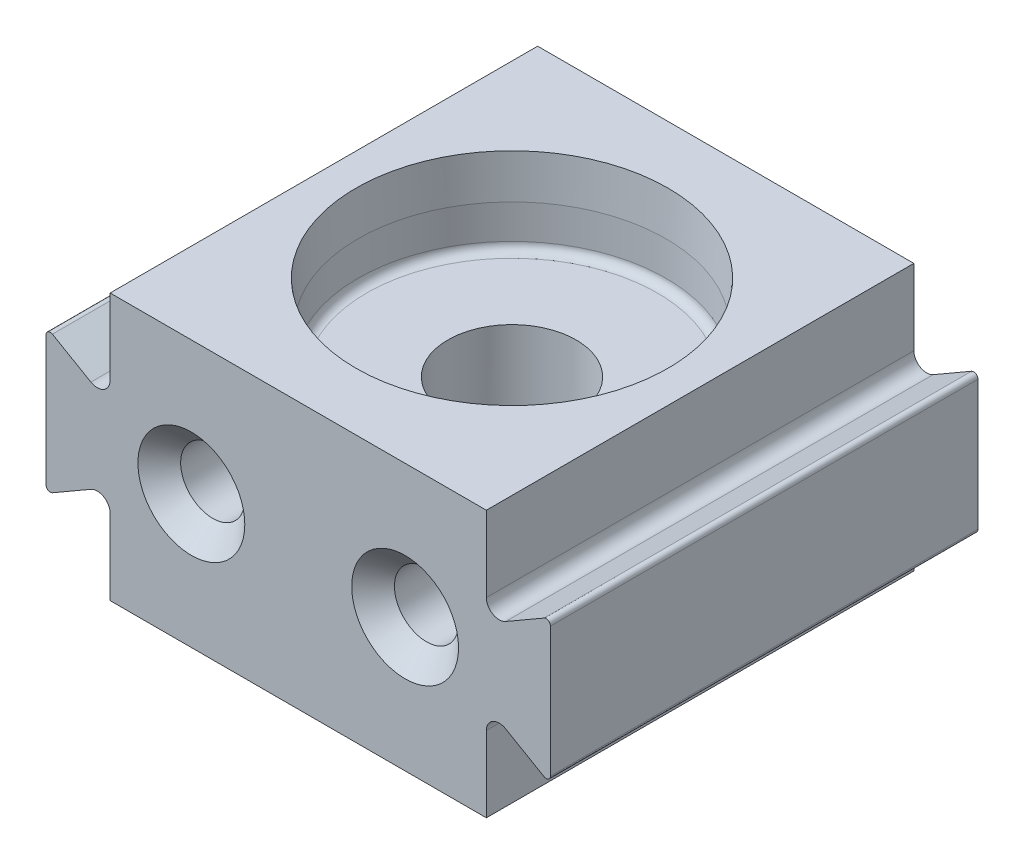
ISO-10303-21;
HEADER;
FILE_DESCRIPTION(('STEP AP214'),'2;1');
FILE_NAME('part.step','',(''),(''),'','','');
FILE_SCHEMA(('AUTOMOTIVE_DESIGN { 1 0 10303 214 1 1 1 1 }'));
ENDSEC;
DATA;
#1=APPLICATION_CONTEXT('core data for automotive mechanical design processes');
#2=APPLICATION_PROTOCOL_DEFINITION('international standard','automotive_design',2000,#1);
#3=PRODUCT_CONTEXT('',#1,'mechanical');
#4=PRODUCT('Part','Part','',(#3));
#5=PRODUCT_RELATED_PRODUCT_CATEGORY('part','',(#4));
#6=PRODUCT_DEFINITION_FORMATION('','',#4);
#7=PRODUCT_DEFINITION_CONTEXT('part definition',#1,'design');
#8=PRODUCT_DEFINITION('design','',#6,#7);
#9=PRODUCT_DEFINITION_SHAPE('','',#8);
#10=(LENGTH_UNIT() NAMED_UNIT(*) SI_UNIT(.MILLI.,.METRE.));
#11=(NAMED_UNIT(*) PLANE_ANGLE_UNIT() SI_UNIT($,.RADIAN.));
#12=(NAMED_UNIT(*) SI_UNIT($,.STERADIAN.) SOLID_ANGLE_UNIT());
#13=UNCERTAINTY_MEASURE_WITH_UNIT(LENGTH_MEASURE(1.E-05),#10,'distance_accuracy_value','');
#14=(GEOMETRIC_REPRESENTATION_CONTEXT(3) GLOBAL_UNCERTAINTY_ASSIGNED_CONTEXT((#13)) GLOBAL_UNIT_ASSIGNED_CONTEXT((#10,
#11,#12)) REPRESENTATION_CONTEXT('',''));
#15=CARTESIAN_POINT('',(0.,0.,0.));
#16=DIRECTION('',(0.,0.,1.));
#17=DIRECTION('',(1.,0.,0.));
#18=AXIS2_PLACEMENT_3D('',#15,#16,#17);
#19=CARTESIAN_POINT('',(0.70710678111713,-14.2039017323597,-20.));
#20=DIRECTION('',(0.,1.,0.));
#21=DIRECTION('',(0.,0.,1.));
#22=AXIS2_PLACEMENT_3D('',#19,#20,#21);
#23=PLANE('',#22);
#24=CARTESIAN_POINT('',(0.70710678111713,-14.2039017323597,-10.));
#25=DIRECTION('',(0.,1.,0.));
#26=DIRECTION('',(0.,0.,1.));
#27=AXIS2_PLACEMENT_3D('',#24,#25,#26);
#28=CIRCLE('',#27,7.29999999999996);
#29=CARTESIAN_POINT('',(0.70710678111713,-14.2039017323597,-2.70000000000004));
#30=VERTEX_POINT('',#29);
#31=EDGE_CURVE('E245',#30,#30,#28,.F.);
#32=ORIENTED_EDGE('',*,*,#31,.T.);
#33=EDGE_LOOP('',(#32));
#34=FACE_BOUND('',#33,.T.);
#35=DIRECTION('',(-1.,0.,0.));
#36=VECTOR('',#35,1.);
#37=CARTESIAN_POINT('',(0.70710678111713,-14.2039017323597,0.));
#38=LINE('',#37,#36);
#39=CARTESIAN_POINT('',(9.50710678111713,-14.2039017323597,0.));
#40=VERTEX_POINT('',#39);
#41=CARTESIAN_POINT('',(-8.09289321888287,-14.2039017323597,0.));
#42=VERTEX_POINT('',#41);
#43=EDGE_CURVE('E155',#40,#42,#38,.T.);
#44=ORIENTED_EDGE('',*,*,#43,.F.);
#45=DIRECTION('',(0.,0.,1.));
#46=VECTOR('',#45,1.);
#47=CARTESIAN_POINT('',(9.50710678111713,-14.2039017323597,-20.));
#48=LINE('',#47,#46);
#49=CARTESIAN_POINT('',(9.50710678111713,-14.2039017323597,-20.));
#50=VERTEX_POINT('',#49);
#51=EDGE_CURVE('E359',#50,#40,#48,.T.);
#52=ORIENTED_EDGE('',*,*,#51,.F.);
#53=DIRECTION('',(-1.,0.,0.));
#54=VECTOR('',#53,1.);
#55=CARTESIAN_POINT('',(0.70710678111713,-14.2039017323597,-20.));
#56=LINE('',#55,#54);
#57=CARTESIAN_POINT('',(-8.09289321888287,-14.2039017323597,-20.));
#58=VERTEX_POINT('',#57);
#59=EDGE_CURVE('E186',#50,#58,#56,.T.);
#60=ORIENTED_EDGE('',*,*,#59,.T.);
#61=DIRECTION('',(0.,0.,1.));
#62=VECTOR('',#61,1.);
#63=CARTESIAN_POINT('',(-8.09289321888287,-14.2039017323597,-20.));
#64=LINE('',#63,#62);
#65=EDGE_CURVE('E100',#58,#42,#64,.T.);
#66=ORIENTED_EDGE('',*,*,#65,.T.);
#67=EDGE_LOOP('',(#44,#52,#60,#66));
#68=FACE_BOUND('',#67,.T.);
#69=ADVANCED_FACE('F35',(#34,#68),#23,.T.);
#70=CARTESIAN_POINT('',(-8.09289321888287,-26.6680033474975,-20.));
#71=DIRECTION('',(0.,-1.,0.));
#72=DIRECTION('',(0.,0.,-1.));
#73=AXIS2_PLACEMENT_3D('',#70,#71,#72);
#74=PLANE('',#73);
#75=CARTESIAN_POINT('',(0.70710678111713,-26.6680033474975,-10.));
#76=DIRECTION('',(0.,-1.,0.));
#77=DIRECTION('',(0.,0.,-1.));
#78=AXIS2_PLACEMENT_3D('',#75,#76,#77);
#79=CIRCLE('',#78,7.3);
#80=CARTESIAN_POINT('',(0.70710678111713,-26.6680033474975,-17.3));
#81=VERTEX_POINT('',#80);
#82=EDGE_CURVE('E45',#81,#81,#79,.F.);
#83=ORIENTED_EDGE('',*,*,#82,.T.);
#84=EDGE_LOOP('',(#83));
#85=FACE_BOUND('',#84,.T.);
#86=DIRECTION('',(1.,0.,0.));
#87=VECTOR('',#86,1.);
#88=CARTESIAN_POINT('',(-8.09289321888287,-26.6680033474975,0.));
#89=LINE('',#88,#87);
#90=CARTESIAN_POINT('',(-8.09289321888287,-26.6680033474975,0.));
#91=VERTEX_POINT('',#90);
#92=CARTESIAN_POINT('',(9.50710678111713,-26.6680033474975,0.));
#93=VERTEX_POINT('',#92);
#94=EDGE_CURVE('E183',#91,#93,#89,.T.);
#95=ORIENTED_EDGE('',*,*,#94,.F.);
#96=DIRECTION('',(0.,0.,1.));
#97=VECTOR('',#96,1.);
#98=CARTESIAN_POINT('',(-8.09289321888287,-26.6680033474975,-20.));
#99=LINE('',#98,#97);
#100=CARTESIAN_POINT('',(-8.09289321888287,-26.6680033474975,-20.));
#101=VERTEX_POINT('',#100);
#102=EDGE_CURVE('E53',#101,#91,#99,.T.);
#103=ORIENTED_EDGE('',*,*,#102,.F.);
#104=DIRECTION('',(1.,0.,0.));
#105=VECTOR('',#104,1.);
#106=CARTESIAN_POINT('',(-8.09289321888287,-26.6680033474975,-20.));
#107=LINE('',#106,#105);
#108=CARTESIAN_POINT('',(9.50710678111713,-26.6680033474975,-20.));
#109=VERTEX_POINT('',#108);
#110=EDGE_CURVE('E153',#101,#109,#107,.T.);
#111=ORIENTED_EDGE('',*,*,#110,.T.);
#112=DIRECTION('',(0.,0.,1.));
#113=VECTOR('',#112,1.);
#114=CARTESIAN_POINT('',(9.50710678111713,-26.6680033474975,-20.));
#115=LINE('',#114,#113);
#116=EDGE_CURVE('E159',#109,#93,#115,.T.);
#117=ORIENTED_EDGE('',*,*,#116,.T.);
#118=EDGE_LOOP('',(#95,#103,#111,#117));
#119=FACE_BOUND('',#118,.T.);
#120=ADVANCED_FACE('F250',(#85,#119),#74,.T.);
#121=CARTESIAN_POINT('',(-8.09289321888287,-26.6680033474975,-20.));
#122=DIRECTION('',(-1.,0.,0.));
#123=DIRECTION('',(0.,-1.,0.));
#124=AXIS2_PLACEMENT_3D('',#121,#122,#123);
#125=PLANE('',#124);
#126=DIRECTION('',(0.,-1.,0.));
#127=VECTOR('',#126,1.);
#128=CARTESIAN_POINT('',(-8.09289321888287,-26.6680033474975,0.));
#129=LINE('',#128,#127);
#130=CARTESIAN_POINT('',(-8.09289321888287,-23.1287728629562,0.));
#131=VERTEX_POINT('',#130);
#132=EDGE_CURVE('E180',#131,#91,#129,.T.);
#133=ORIENTED_EDGE('',*,*,#132,.F.);
#134=DIRECTION('',(0.,0.,1.));
#135=VECTOR('',#134,1.);
#136=CARTESIAN_POINT('',(-8.09289321888287,-23.1287728629562,-20.));
#137=LINE('',#136,#135);
#138=CARTESIAN_POINT('',(-8.09289321888287,-23.1287728629562,-20.));
#139=VERTEX_POINT('',#138);
#140=EDGE_CURVE('E89',#139,#131,#137,.T.);
#141=ORIENTED_EDGE('',*,*,#140,.F.);
#142=DIRECTION('',(0.,-1.,0.));
#143=VECTOR('',#142,1.);
#144=CARTESIAN_POINT('',(-8.09289321888287,-26.6680033474975,-20.));
#145=LINE('',#144,#143);
#146=EDGE_CURVE('E143',#139,#101,#145,.T.);
#147=ORIENTED_EDGE('',*,*,#146,.T.);
#148=ORIENTED_EDGE('',*,*,#102,.T.);
#149=EDGE_LOOP('',(#133,#141,#147,#148));
#150=FACE_BOUND('',#149,.T.);
#151=ADVANCED_FACE('F267',(#150),#125,.T.);
#152=CARTESIAN_POINT('',(-8.69289321888287,-23.1287728629562,-20.));
#153=DIRECTION('',(0.,0.,1.));
#154=DIRECTION('',(1.,0.,0.));
#155=AXIS2_PLACEMENT_3D('',#152,#153,#154);
#156=CYLINDRICAL_SURFACE('',#155,0.599999999999998);
#157=CARTESIAN_POINT('',(-8.69289321888287,-23.1287728629562,0.));
#158=DIRECTION('',(0.,0.,-1.));
#159=DIRECTION('',(1.,0.,0.));
#160=AXIS2_PLACEMENT_3D('',#157,#158,#159);
#161=CIRCLE('',#160,0.599999999999998);
#162=CARTESIAN_POINT('',(-8.99289321888287,-22.6091576206855,0.));
#163=VERTEX_POINT('',#162);
#164=EDGE_CURVE('E128',#163,#131,#161,.T.);
#165=ORIENTED_EDGE('',*,*,#164,.F.);
#166=DIRECTION('',(0.,0.,1.));
#167=VECTOR('',#166,1.);
#168=CARTESIAN_POINT('',(-8.99289321888287,-22.6091576206855,-20.));
#169=LINE('',#168,#167);
#170=CARTESIAN_POINT('',(-8.99289321888287,-22.6091576206855,-20.));
#171=VERTEX_POINT('',#170);
#172=EDGE_CURVE('E123',#171,#163,#169,.T.);
#173=ORIENTED_EDGE('',*,*,#172,.F.);
#174=CARTESIAN_POINT('',(-8.69289321888287,-23.1287728629562,-20.));
#175=DIRECTION('',(0.,0.,-1.));
#176=DIRECTION('',(1.,0.,0.));
#177=AXIS2_PLACEMENT_3D('',#174,#175,#176);
#178=CIRCLE('',#177,0.599999999999998);
#179=EDGE_CURVE('E126',#171,#139,#178,.T.);
#180=ORIENTED_EDGE('',*,*,#179,.T.);
#181=ORIENTED_EDGE('',*,*,#140,.T.);
#182=EDGE_LOOP('',(#165,#173,#180,#181));
#183=FACE_BOUND('',#182,.T.);
#184=ADVANCED_FACE('F125',(#183),#156,.F.);
#185=CARTESIAN_POINT('',(-8.99289321888287,-22.6091576206855,-20.));
#186=DIRECTION('',(0.500000000000004,-0.866025403784437,0.));
#187=DIRECTION('',(0.866025403784437,0.500000000000004,0.));
#188=AXIS2_PLACEMENT_3D('',#185,#186,#187);
#189=PLANE('',#188);
#190=DIRECTION('',(0.866025403784437,0.500000000000004,0.));
#191=VECTOR('',#190,1.);
#192=CARTESIAN_POINT('',(-8.99289321888287,-22.6091576206855,0.));
#193=LINE('',#192,#191);
#194=CARTESIAN_POINT('',(-10.7928932188829,-23.6483881052269,0.));
#195=VERTEX_POINT('',#194);
#196=EDGE_CURVE('E177',#195,#163,#193,.T.);
#197=ORIENTED_EDGE('',*,*,#196,.F.);
#198=DIRECTION('',(0.,0.,1.));
#199=VECTOR('',#198,1.);
#200=CARTESIAN_POINT('',(-10.7928932188829,-23.6483881052269,-20.));
#201=LINE('',#200,#199);
#202=CARTESIAN_POINT('',(-10.7928932188829,-23.6483881052269,-20.));
#203=VERTEX_POINT('',#202);
#204=EDGE_CURVE('E133',#203,#195,#201,.T.);
#205=ORIENTED_EDGE('',*,*,#204,.F.);
#206=DIRECTION('',(0.866025403784437,0.500000000000004,0.));
#207=VECTOR('',#206,1.);
#208=CARTESIAN_POINT('',(-8.99289321888287,-22.6091576206855,-20.));
#209=LINE('',#208,#207);
#210=EDGE_CURVE('E141',#203,#171,#209,.T.);
#211=ORIENTED_EDGE('',*,*,#210,.T.);
#212=ORIENTED_EDGE('',*,*,#172,.T.);
#213=EDGE_LOOP('',(#197,#205,#211,#212));
#214=FACE_BOUND('',#213,.T.);
#215=ADVANCED_FACE('F145',(#214),#189,.T.);
#216=CARTESIAN_POINT('',(-10.8928932188829,-23.47518302447,-20.));
#217=DIRECTION('',(0.,0.,1.));
#218=DIRECTION('',(1.,0.,0.));
#219=AXIS2_PLACEMENT_3D('',#216,#217,#218);
#220=CYLINDRICAL_SURFACE('',#219,0.199999999999999);
#221=CARTESIAN_POINT('',(-10.8928932188829,-23.47518302447,0.));
#222=DIRECTION('',(0.,0.,1.));
#223=DIRECTION('',(1.,0.,0.));
#224=AXIS2_PLACEMENT_3D('',#221,#222,#223);
#225=CIRCLE('',#224,0.199999999999999);
#226=CARTESIAN_POINT('',(-11.0928932188829,-23.47518302447,0.));
#227=VERTEX_POINT('',#226);
#228=EDGE_CURVE('E174',#227,#195,#225,.T.);
#229=ORIENTED_EDGE('',*,*,#228,.F.);
#230=DIRECTION('',(0.,0.,1.));
#231=VECTOR('',#230,1.);
#232=CARTESIAN_POINT('',(-11.0928932188829,-23.47518302447,-20.));
#233=LINE('',#232,#231);
#234=CARTESIAN_POINT('',(-11.0928932188829,-23.47518302447,-20.));
#235=VERTEX_POINT('',#234);
#236=EDGE_CURVE('E191',#235,#227,#233,.T.);
#237=ORIENTED_EDGE('',*,*,#236,.F.);
#238=CARTESIAN_POINT('',(-10.8928932188829,-23.47518302447,-20.));
#239=DIRECTION('',(0.,0.,1.));
#240=DIRECTION('',(1.,0.,0.));
#241=AXIS2_PLACEMENT_3D('',#238,#239,#240);
#242=CIRCLE('',#241,0.199999999999999);
#243=EDGE_CURVE('E146',#235,#203,#242,.T.);
#244=ORIENTED_EDGE('',*,*,#243,.T.);
#245=ORIENTED_EDGE('',*,*,#204,.T.);
#246=EDGE_LOOP('',(#229,#237,#244,#245));
#247=FACE_BOUND('',#246,.T.);
#248=ADVANCED_FACE('F562',(#247),#220,.T.);
#249=CARTESIAN_POINT('',(-11.0928932188829,-23.47518302447,-20.));
#250=DIRECTION('',(-1.,0.,0.));
#251=DIRECTION('',(0.,0.,1.));
#252=AXIS2_PLACEMENT_3D('',#249,#250,#251);
#253=PLANE('',#252);
#254=DIRECTION('',(0.,-1.,0.));
#255=VECTOR('',#254,1.);
#256=CARTESIAN_POINT('',(-11.0928932188829,-23.47518302447,0.));
#257=LINE('',#256,#255);
#258=CARTESIAN_POINT('',(-11.0928932188829,-17.3967220553873,0.));
#259=VERTEX_POINT('',#258);
#260=EDGE_CURVE('E171',#259,#227,#257,.T.);
#261=ORIENTED_EDGE('',*,*,#260,.F.);
#262=DIRECTION('',(0.,0.,1.));
#263=VECTOR('',#262,1.);
#264=CARTESIAN_POINT('',(-11.0928932188829,-17.3967220553873,-20.));
#265=LINE('',#264,#263);
#266=CARTESIAN_POINT('',(-11.0928932188829,-17.3967220553873,-20.));
#267=VERTEX_POINT('',#266);
#268=EDGE_CURVE('E193',#267,#259,#265,.T.);
#269=ORIENTED_EDGE('',*,*,#268,.F.);
#270=DIRECTION('',(0.,-1.,0.));
#271=VECTOR('',#270,1.);
#272=CARTESIAN_POINT('',(-11.0928932188829,-23.47518302447,-20.));
#273=LINE('',#272,#271);
#274=EDGE_CURVE('E148',#267,#235,#273,.T.);
#275=ORIENTED_EDGE('',*,*,#274,.T.);
#276=ORIENTED_EDGE('',*,*,#236,.T.);
#277=EDGE_LOOP('',(#261,#269,#275,#276));
#278=FACE_BOUND('',#277,.T.);
#279=ADVANCED_FACE('F429',(#278),#253,.T.);
#280=CARTESIAN_POINT('',(-10.8928932188829,-17.3967220553873,-20.));
#281=DIRECTION('',(0.,0.,1.));
#282=DIRECTION('',(1.,0.,0.));
#283=AXIS2_PLACEMENT_3D('',#280,#281,#282);
#284=CYLINDRICAL_SURFACE('',#283,0.199999999999999);
#285=CARTESIAN_POINT('',(-10.8928932188829,-17.3967220553873,0.));
#286=DIRECTION('',(0.,0.,1.));
#287=DIRECTION('',(1.,0.,0.));
#288=AXIS2_PLACEMENT_3D('',#285,#286,#287);
#289=CIRCLE('',#288,0.199999999999999);
#290=CARTESIAN_POINT('',(-10.7928932188829,-17.2235169746304,0.));
#291=VERTEX_POINT('',#290);
#292=EDGE_CURVE('E168',#291,#259,#289,.T.);
#293=ORIENTED_EDGE('',*,*,#292,.F.);
#294=DIRECTION('',(0.,0.,1.));
#295=VECTOR('',#294,1.);
#296=CARTESIAN_POINT('',(-10.7928932188829,-17.2235169746304,-20.));
#297=LINE('',#296,#295);
#298=CARTESIAN_POINT('',(-10.7928932188829,-17.2235169746304,-20.));
#299=VERTEX_POINT('',#298);
#300=EDGE_CURVE('E195',#299,#291,#297,.T.);
#301=ORIENTED_EDGE('',*,*,#300,.F.);
#302=CARTESIAN_POINT('',(-10.8928932188829,-17.3967220553873,-20.));
#303=DIRECTION('',(0.,0.,1.));
#304=DIRECTION('',(1.,0.,0.));
#305=AXIS2_PLACEMENT_3D('',#302,#303,#304);
#306=CIRCLE('',#305,0.199999999999999);
#307=EDGE_CURVE('E423',#299,#267,#306,.T.);
#308=ORIENTED_EDGE('',*,*,#307,.T.);
#309=ORIENTED_EDGE('',*,*,#268,.T.);
#310=EDGE_LOOP('',(#293,#301,#308,#309));
#311=FACE_BOUND('',#310,.T.);
#312=ADVANCED_FACE('F435',(#311),#284,.T.);
#313=CARTESIAN_POINT('',(-10.7928932188829,-17.2235169746304,-20.));
#314=DIRECTION('',(0.500000000000005,0.866025403784436,0.));
#315=DIRECTION('',(-0.866025403784436,0.500000000000005,0.));
#316=AXIS2_PLACEMENT_3D('',#313,#314,#315);
#317=PLANE('',#316);
#318=DIRECTION('',(-0.866025403784436,0.500000000000005,0.));
#319=VECTOR('',#318,1.);
#320=CARTESIAN_POINT('',(-10.7928932188829,-17.2235169746304,0.));
#321=LINE('',#320,#319);
#322=CARTESIAN_POINT('',(-8.99289321888287,-18.2627474591717,0.));
#323=VERTEX_POINT('',#322);
#324=EDGE_CURVE('E165',#323,#291,#321,.T.);
#325=ORIENTED_EDGE('',*,*,#324,.F.);
#326=DIRECTION('',(0.,0.,1.));
#327=VECTOR('',#326,1.);
#328=CARTESIAN_POINT('',(-8.99289321888287,-18.2627474591717,-20.));
#329=LINE('',#328,#327);
#330=CARTESIAN_POINT('',(-8.99289321888287,-18.2627474591717,-20.));
#331=VERTEX_POINT('',#330);
#332=EDGE_CURVE('E197',#331,#323,#329,.T.);
#333=ORIENTED_EDGE('',*,*,#332,.F.);
#334=DIRECTION('',(-0.866025403784436,0.500000000000005,0.));
#335=VECTOR('',#334,1.);
#336=CARTESIAN_POINT('',(-10.7928932188829,-17.2235169746304,-20.));
#337=LINE('',#336,#335);
#338=EDGE_CURVE('E420',#331,#299,#337,.T.);
#339=ORIENTED_EDGE('',*,*,#338,.T.);
#340=ORIENTED_EDGE('',*,*,#300,.T.);
#341=EDGE_LOOP('',(#325,#333,#339,#340));
#342=FACE_BOUND('',#341,.T.);
#343=ADVANCED_FACE('F438',(#342),#317,.T.);
#344=CARTESIAN_POINT('',(-8.69289321888287,-17.7431322169011,-20.));
#345=DIRECTION('',(0.,0.,1.));
#346=DIRECTION('',(1.,0.,0.));
#347=AXIS2_PLACEMENT_3D('',#344,#345,#346);
#348=CYLINDRICAL_SURFACE('',#347,0.599999999999999);
#349=CARTESIAN_POINT('',(-8.69289321888287,-17.7431322169011,0.));
#350=DIRECTION('',(0.,0.,-1.));
#351=DIRECTION('',(1.,0.,0.));
#352=AXIS2_PLACEMENT_3D('',#349,#350,#351);
#353=CIRCLE('',#352,0.599999999999999);
#354=CARTESIAN_POINT('',(-8.09289321888287,-17.7431322169011,0.));
#355=VERTEX_POINT('',#354);
#356=EDGE_CURVE('E162',#355,#323,#353,.T.);
#357=ORIENTED_EDGE('',*,*,#356,.F.);
#358=DIRECTION('',(0.,0.,1.));
#359=VECTOR('',#358,1.);
#360=CARTESIAN_POINT('',(-8.09289321888287,-17.7431322169011,-20.));
#361=LINE('',#360,#359);
#362=CARTESIAN_POINT('',(-8.09289321888287,-17.7431322169011,-20.));
#363=VERTEX_POINT('',#362);
#364=EDGE_CURVE('E199',#363,#355,#361,.T.);
#365=ORIENTED_EDGE('',*,*,#364,.F.);
#366=CARTESIAN_POINT('',(-8.69289321888287,-17.7431322169011,-20.));
#367=DIRECTION('',(0.,0.,-1.));
#368=DIRECTION('',(1.,0.,0.));
#369=AXIS2_PLACEMENT_3D('',#366,#367,#368);
#370=CIRCLE('',#369,0.599999999999999);
#371=EDGE_CURVE('E417',#363,#331,#370,.T.);
#372=ORIENTED_EDGE('',*,*,#371,.T.);
#373=ORIENTED_EDGE('',*,*,#332,.T.);
#374=EDGE_LOOP('',(#357,#365,#372,#373));
#375=FACE_BOUND('',#374,.T.);
#376=ADVANCED_FACE('F442',(#375),#348,.F.);
#377=CARTESIAN_POINT('',(-8.09289321888287,-17.7431322169011,-20.));
#378=DIRECTION('',(-1.,0.,0.));
#379=DIRECTION('',(0.,0.,1.));
#380=AXIS2_PLACEMENT_3D('',#377,#378,#379);
#381=PLANE('',#380);
#382=DIRECTION('',(0.,-1.,0.));
#383=VECTOR('',#382,1.);
#384=CARTESIAN_POINT('',(-8.09289321888287,-17.7431322169011,0.));
#385=LINE('',#384,#383);
#386=EDGE_CURVE('E158',#42,#355,#385,.T.);
#387=ORIENTED_EDGE('',*,*,#386,.F.);
#388=ORIENTED_EDGE('',*,*,#65,.F.);
#389=DIRECTION('',(0.,-1.,0.));
#390=VECTOR('',#389,1.);
#391=CARTESIAN_POINT('',(-8.09289321888287,-17.7431322169011,-20.));
#392=LINE('',#391,#390);
#393=EDGE_CURVE('E415',#58,#363,#392,.T.);
#394=ORIENTED_EDGE('',*,*,#393,.T.);
#395=ORIENTED_EDGE('',*,*,#364,.T.);
#396=EDGE_LOOP('',(#387,#388,#394,#395));
#397=FACE_BOUND('',#396,.T.);
#398=ADVANCED_FACE('F272',(#397),#381,.T.);
#399=CARTESIAN_POINT('',(-8.69289321888287,-17.7431322169011,-20.));
#400=DIRECTION('',(0.,0.,1.));
#401=DIRECTION('',(1.,0.,0.));
#402=AXIS2_PLACEMENT_3D('',#399,#400,#401);
#403=PLANE('',#402);
#404=CARTESIAN_POINT('',(-4.29289321888287,-20.4359525399286,-20.));
#405=DIRECTION('',(0.,0.,1.));
#406=DIRECTION('',(1.,0.,0.));
#407=AXIS2_PLACEMENT_3D('',#404,#405,#406);
#408=CIRCLE('',#407,2.5);
#409=CARTESIAN_POINT('',(-1.79289321888287,-20.4359525399286,-20.));
#410=VERTEX_POINT('',#409);
#411=EDGE_CURVE('E215',#410,#410,#408,.T.);
#412=ORIENTED_EDGE('',*,*,#411,.T.);
#413=EDGE_LOOP('',(#412));
#414=FACE_BOUND('',#413,.T.);
#415=CARTESIAN_POINT('',(5.70710678111713,-20.4359525399286,-20.));
#416=DIRECTION('',(0.,0.,1.));
#417=DIRECTION('',(1.,0.,0.));
#418=AXIS2_PLACEMENT_3D('',#415,#416,#417);
#419=CIRCLE('',#418,2.50000000000001);
#420=CARTESIAN_POINT('',(8.20710678111714,-20.4359525399286,-20.));
#421=VERTEX_POINT('',#420);
#422=EDGE_CURVE('E212',#421,#421,#419,.T.);
#423=ORIENTED_EDGE('',*,*,#422,.T.);
#424=EDGE_LOOP('',(#423));
#425=FACE_BOUND('',#424,.T.);
#426=ORIENTED_EDGE('',*,*,#59,.F.);
#427=DIRECTION('',(0.,-1.,0.));
#428=VECTOR('',#427,1.);
#429=CARTESIAN_POINT('',(9.50710678111713,-17.7431322169011,-20.));
#430=LINE('',#429,#428);
#431=CARTESIAN_POINT('',(9.50710678111713,-17.7431322169011,-20.));
#432=VERTEX_POINT('',#431);
#433=EDGE_CURVE('E331',#50,#432,#430,.T.);
#434=ORIENTED_EDGE('',*,*,#433,.T.);
#435=CARTESIAN_POINT('',(10.1071067811171,-17.7431322169011,-20.));
#436=DIRECTION('',(0.,0.,1.));
#437=DIRECTION('',(-1.,0.,0.));
#438=AXIS2_PLACEMENT_3D('',#435,#436,#437);
#439=CIRCLE('',#438,0.599999999999999);
#440=CARTESIAN_POINT('',(10.4071067811171,-18.2627474591717,-20.));
#441=VERTEX_POINT('',#440);
#442=EDGE_CURVE('E334',#432,#441,#439,.T.);
#443=ORIENTED_EDGE('',*,*,#442,.T.);
#444=DIRECTION('',(0.866025403784436,0.500000000000005,0.));
#445=VECTOR('',#444,1.);
#446=CARTESIAN_POINT('',(12.2071067811171,-17.2235169746304,-20.));
#447=LINE('',#446,#445);
#448=CARTESIAN_POINT('',(12.2071067811171,-17.2235169746304,-20.));
#449=VERTEX_POINT('',#448);
#450=EDGE_CURVE('E338',#441,#449,#447,.T.);
#451=ORIENTED_EDGE('',*,*,#450,.T.);
#452=CARTESIAN_POINT('',(12.3071067811171,-17.3967220553873,-20.));
#453=DIRECTION('',(0.,0.,-1.));
#454=DIRECTION('',(-1.,0.,0.));
#455=AXIS2_PLACEMENT_3D('',#452,#453,#454);
#456=CIRCLE('',#455,0.199999999999999);
#457=CARTESIAN_POINT('',(12.5071067811171,-17.3967220553873,-20.));
#458=VERTEX_POINT('',#457);
#459=EDGE_CURVE('E341',#449,#458,#456,.T.);
#460=ORIENTED_EDGE('',*,*,#459,.T.);
#461=DIRECTION('',(0.,-1.,0.));
#462=VECTOR('',#461,1.);
#463=CARTESIAN_POINT('',(12.5071067811171,-23.47518302447,-20.));
#464=LINE('',#463,#462);
#465=CARTESIAN_POINT('',(12.5071067811171,-23.47518302447,-20.));
#466=VERTEX_POINT('',#465);
#467=EDGE_CURVE('E344',#458,#466,#464,.T.);
#468=ORIENTED_EDGE('',*,*,#467,.T.);
#469=CARTESIAN_POINT('',(12.3071067811171,-23.47518302447,-20.));
#470=DIRECTION('',(0.,0.,-1.));
#471=DIRECTION('',(-1.,0.,0.));
#472=AXIS2_PLACEMENT_3D('',#469,#470,#471);
#473=CIRCLE('',#472,0.199999999999999);
#474=CARTESIAN_POINT('',(12.2071067811171,-23.6483881052269,-20.));
#475=VERTEX_POINT('',#474);
#476=EDGE_CURVE('E347',#466,#475,#473,.T.);
#477=ORIENTED_EDGE('',*,*,#476,.T.);
#478=DIRECTION('',(-0.866025403784437,0.500000000000004,0.));
#479=VECTOR('',#478,1.);
#480=CARTESIAN_POINT('',(10.4071067811171,-22.6091576206855,-20.));
#481=LINE('',#480,#479);
#482=CARTESIAN_POINT('',(10.4071067811171,-22.6091576206855,-20.));
#483=VERTEX_POINT('',#482);
#484=EDGE_CURVE('E350',#475,#483,#481,.T.);
#485=ORIENTED_EDGE('',*,*,#484,.T.);
#486=CARTESIAN_POINT('',(10.1071067811171,-23.1287728629562,-20.));
#487=DIRECTION('',(0.,0.,1.));
#488=DIRECTION('',(-1.,0.,0.));
#489=AXIS2_PLACEMENT_3D('',#486,#487,#488);
#490=CIRCLE('',#489,0.599999999999998);
#491=CARTESIAN_POINT('',(9.50710678111713,-23.1287728629562,-20.));
#492=VERTEX_POINT('',#491);
#493=EDGE_CURVE('E353',#483,#492,#490,.T.);
#494=ORIENTED_EDGE('',*,*,#493,.T.);
#495=DIRECTION('',(0.,-1.,0.));
#496=VECTOR('',#495,1.);
#497=CARTESIAN_POINT('',(9.50710678111713,-26.6680033474975,-20.));
#498=LINE('',#497,#496);
#499=EDGE_CURVE('E356',#492,#109,#498,.T.);
#500=ORIENTED_EDGE('',*,*,#499,.T.);
#501=ORIENTED_EDGE('',*,*,#110,.F.);
#502=ORIENTED_EDGE('',*,*,#146,.F.);
#503=ORIENTED_EDGE('',*,*,#179,.F.);
#504=ORIENTED_EDGE('',*,*,#210,.F.);
#505=ORIENTED_EDGE('',*,*,#243,.F.);
#506=ORIENTED_EDGE('',*,*,#274,.F.);
#507=ORIENTED_EDGE('',*,*,#307,.F.);
#508=ORIENTED_EDGE('',*,*,#338,.F.);
#509=ORIENTED_EDGE('',*,*,#371,.F.);
#510=ORIENTED_EDGE('',*,*,#393,.F.);
#511=EDGE_LOOP('',(#426,#434,#443,#451,#460,#468,#477,#485,#494,#500,#501,#502,#503,#504,#505,
#506,#507,#508,#509,#510));
#512=FACE_BOUND('',#511,.T.);
#513=ADVANCED_FACE('F139',(#414,#425,#512),#403,.F.);
#514=CARTESIAN_POINT('',(-8.69289321888287,-17.7431322169011,0.));
#515=DIRECTION('',(0.,0.,1.));
#516=DIRECTION('',(1.,0.,0.));
#517=AXIS2_PLACEMENT_3D('',#514,#515,#516);
#518=PLANE('',#517);
#519=CARTESIAN_POINT('',(5.70710678111713,-20.4359525399286,0.));
#520=DIRECTION('',(0.,0.,1.));
#521=DIRECTION('',(1.,0.,0.));
#522=AXIS2_PLACEMENT_3D('',#519,#520,#521);
#523=CIRCLE('',#522,2.5);
#524=CARTESIAN_POINT('',(8.20710678111713,-20.4359525399286,0.));
#525=VERTEX_POINT('',#524);
#526=EDGE_CURVE('E227',#525,#525,#523,.F.);
#527=ORIENTED_EDGE('',*,*,#526,.T.);
#528=EDGE_LOOP('',(#527));
#529=FACE_BOUND('',#528,.T.);
#530=CARTESIAN_POINT('',(-4.29289321888287,-20.4359525399286,0.));
#531=DIRECTION('',(0.,0.,1.));
#532=DIRECTION('',(1.,0.,0.));
#533=AXIS2_PLACEMENT_3D('',#530,#531,#532);
#534=CIRCLE('',#533,2.5);
#535=CARTESIAN_POINT('',(-1.79289321888287,-20.4359525399286,0.));
#536=VERTEX_POINT('',#535);
#537=EDGE_CURVE('E224',#536,#536,#534,.F.);
#538=ORIENTED_EDGE('',*,*,#537,.T.);
#539=EDGE_LOOP('',(#538));
#540=FACE_BOUND('',#539,.T.);
#541=ORIENTED_EDGE('',*,*,#43,.T.);
#542=ORIENTED_EDGE('',*,*,#386,.T.);
#543=ORIENTED_EDGE('',*,*,#356,.T.);
#544=ORIENTED_EDGE('',*,*,#324,.T.);
#545=ORIENTED_EDGE('',*,*,#292,.T.);
#546=ORIENTED_EDGE('',*,*,#260,.T.);
#547=ORIENTED_EDGE('',*,*,#228,.T.);
#548=ORIENTED_EDGE('',*,*,#196,.T.);
#549=ORIENTED_EDGE('',*,*,#164,.T.);
#550=ORIENTED_EDGE('',*,*,#132,.T.);
#551=ORIENTED_EDGE('',*,*,#94,.T.);
#552=DIRECTION('',(0.,-1.,0.));
#553=VECTOR('',#552,1.);
#554=CARTESIAN_POINT('',(9.50710678111713,-26.6680033474975,0.));
#555=LINE('',#554,#553);
#556=CARTESIAN_POINT('',(9.50710678111713,-23.1287728629562,0.));
#557=VERTEX_POINT('',#556);
#558=EDGE_CURVE('E335',#557,#93,#555,.T.);
#559=ORIENTED_EDGE('',*,*,#558,.F.);
#560=CARTESIAN_POINT('',(10.1071067811171,-23.1287728629562,0.));
#561=DIRECTION('',(0.,0.,1.));
#562=DIRECTION('',(-1.,0.,0.));
#563=AXIS2_PLACEMENT_3D('',#560,#561,#562);
#564=CIRCLE('',#563,0.599999999999998);
#565=CARTESIAN_POINT('',(10.4071067811171,-22.6091576206855,0.));
#566=VERTEX_POINT('',#565);
#567=EDGE_CURVE('E380',#566,#557,#564,.T.);
#568=ORIENTED_EDGE('',*,*,#567,.F.);
#569=DIRECTION('',(-0.866025403784437,0.500000000000004,0.));
#570=VECTOR('',#569,1.);
#571=CARTESIAN_POINT('',(10.4071067811171,-22.6091576206855,0.));
#572=LINE('',#571,#570);
#573=CARTESIAN_POINT('',(12.2071067811171,-23.6483881052269,0.));
#574=VERTEX_POINT('',#573);
#575=EDGE_CURVE('E377',#574,#566,#572,.T.);
#576=ORIENTED_EDGE('',*,*,#575,.F.);
#577=CARTESIAN_POINT('',(12.3071067811171,-23.47518302447,0.));
#578=DIRECTION('',(0.,0.,-1.));
#579=DIRECTION('',(-1.,0.,0.));
#580=AXIS2_PLACEMENT_3D('',#577,#578,#579);
#581=CIRCLE('',#580,0.199999999999999);
#582=CARTESIAN_POINT('',(12.5071067811171,-23.47518302447,0.));
#583=VERTEX_POINT('',#582);
#584=EDGE_CURVE('E374',#583,#574,#581,.T.);
#585=ORIENTED_EDGE('',*,*,#584,.F.);
#586=DIRECTION('',(0.,-1.,0.));
#587=VECTOR('',#586,1.);
#588=CARTESIAN_POINT('',(12.5071067811171,-23.47518302447,0.));
#589=LINE('',#588,#587);
#590=CARTESIAN_POINT('',(12.5071067811171,-17.3967220553873,0.));
#591=VERTEX_POINT('',#590);
#592=EDGE_CURVE('E371',#591,#583,#589,.T.);
#593=ORIENTED_EDGE('',*,*,#592,.F.);
#594=CARTESIAN_POINT('',(12.3071067811171,-17.3967220553873,0.));
#595=DIRECTION('',(0.,0.,-1.));
#596=DIRECTION('',(-1.,0.,0.));
#597=AXIS2_PLACEMENT_3D('',#594,#595,#596);
#598=CIRCLE('',#597,0.199999999999999);
#599=CARTESIAN_POINT('',(12.2071067811171,-17.2235169746304,0.));
#600=VERTEX_POINT('',#599);
#601=EDGE_CURVE('E368',#600,#591,#598,.T.);
#602=ORIENTED_EDGE('',*,*,#601,.F.);
#603=DIRECTION('',(0.866025403784436,0.500000000000005,0.));
#604=VECTOR('',#603,1.);
#605=CARTESIAN_POINT('',(12.2071067811171,-17.2235169746304,0.));
#606=LINE('',#605,#604);
#607=CARTESIAN_POINT('',(10.4071067811171,-18.2627474591717,0.));
#608=VERTEX_POINT('',#607);
#609=EDGE_CURVE('E365',#608,#600,#606,.T.);
#610=ORIENTED_EDGE('',*,*,#609,.F.);
#611=CARTESIAN_POINT('',(10.1071067811171,-17.7431322169011,0.));
#612=DIRECTION('',(0.,0.,1.));
#613=DIRECTION('',(-1.,0.,0.));
#614=AXIS2_PLACEMENT_3D('',#611,#612,#613);
#615=CIRCLE('',#614,0.599999999999999);
#616=CARTESIAN_POINT('',(9.50710678111713,-17.7431322169011,0.));
#617=VERTEX_POINT('',#616);
#618=EDGE_CURVE('E362',#617,#608,#615,.T.);
#619=ORIENTED_EDGE('',*,*,#618,.F.);
#620=DIRECTION('',(0.,-1.,0.));
#621=VECTOR('',#620,1.);
#622=CARTESIAN_POINT('',(9.50710678111713,-17.7431322169011,0.));
#623=LINE('',#622,#621);
#624=EDGE_CURVE('E205',#40,#617,#623,.T.);
#625=ORIENTED_EDGE('',*,*,#624,.F.);
#626=EDGE_LOOP('',(#541,#542,#543,#544,#545,#546,#547,#548,#549,#550,#551,#559,#568,#576,#585,
#593,#602,#610,#619,#625));
#627=FACE_BOUND('',#626,.T.);
#628=ADVANCED_FACE('F477',(#529,#540,#627),#518,.T.);
#629=CARTESIAN_POINT('',(9.50710678111713,-26.6680033474975,-20.));
#630=DIRECTION('',(1.,0.,0.));
#631=DIRECTION('',(0.,-1.,0.));
#632=AXIS2_PLACEMENT_3D('',#629,#630,#631);
#633=PLANE('',#632);
#634=ORIENTED_EDGE('',*,*,#558,.T.);
#635=ORIENTED_EDGE('',*,*,#116,.F.);
#636=ORIENTED_EDGE('',*,*,#499,.F.);
#637=DIRECTION('',(0.,0.,1.));
#638=VECTOR('',#637,1.);
#639=CARTESIAN_POINT('',(9.50710678111713,-23.1287728629562,-20.));
#640=LINE('',#639,#638);
#641=EDGE_CURVE('E387',#492,#557,#640,.T.);
#642=ORIENTED_EDGE('',*,*,#641,.T.);
#643=EDGE_LOOP('',(#634,#635,#636,#642));
#644=FACE_BOUND('',#643,.T.);
#645=ADVANCED_FACE('F480',(#644),#633,.T.);
#646=CARTESIAN_POINT('',(10.1071067811171,-23.1287728629562,-20.));
#647=DIRECTION('',(0.,0.,1.));
#648=DIRECTION('',(-1.,0.,0.));
#649=AXIS2_PLACEMENT_3D('',#646,#647,#648);
#650=CYLINDRICAL_SURFACE('',#649,0.599999999999998);
#651=ORIENTED_EDGE('',*,*,#567,.T.);
#652=ORIENTED_EDGE('',*,*,#641,.F.);
#653=ORIENTED_EDGE('',*,*,#493,.F.);
#654=DIRECTION('',(0.,0.,1.));
#655=VECTOR('',#654,1.);
#656=CARTESIAN_POINT('',(10.4071067811171,-22.6091576206855,-20.));
#657=LINE('',#656,#655);
#658=EDGE_CURVE('E390',#483,#566,#657,.T.);
#659=ORIENTED_EDGE('',*,*,#658,.T.);
#660=EDGE_LOOP('',(#651,#652,#653,#659));
#661=FACE_BOUND('',#660,.T.);
#662=ADVANCED_FACE('F527',(#661),#650,.F.);
#663=CARTESIAN_POINT('',(10.4071067811171,-22.6091576206855,-20.));
#664=DIRECTION('',(-0.500000000000004,-0.866025403784437,0.));
#665=DIRECTION('',(-0.866025403784437,0.500000000000004,0.));
#666=AXIS2_PLACEMENT_3D('',#663,#664,#665);
#667=PLANE('',#666);
#668=ORIENTED_EDGE('',*,*,#575,.T.);
#669=ORIENTED_EDGE('',*,*,#658,.F.);
#670=ORIENTED_EDGE('',*,*,#484,.F.);
#671=DIRECTION('',(0.,0.,1.));
#672=VECTOR('',#671,1.);
#673=CARTESIAN_POINT('',(12.2071067811171,-23.6483881052269,-20.));
#674=LINE('',#673,#672);
#675=EDGE_CURVE('E393',#475,#574,#674,.T.);
#676=ORIENTED_EDGE('',*,*,#675,.T.);
#677=EDGE_LOOP('',(#668,#669,#670,#676));
#678=FACE_BOUND('',#677,.T.);
#679=ADVANCED_FACE('F525',(#678),#667,.T.);
#680=CARTESIAN_POINT('',(12.3071067811171,-23.47518302447,-20.));
#681=DIRECTION('',(0.,0.,1.));
#682=DIRECTION('',(-1.,0.,0.));
#683=AXIS2_PLACEMENT_3D('',#680,#681,#682);
#684=CYLINDRICAL_SURFACE('',#683,0.199999999999999);
#685=ORIENTED_EDGE('',*,*,#584,.T.);
#686=ORIENTED_EDGE('',*,*,#675,.F.);
#687=ORIENTED_EDGE('',*,*,#476,.F.);
#688=DIRECTION('',(0.,0.,1.));
#689=VECTOR('',#688,1.);
#690=CARTESIAN_POINT('',(12.5071067811171,-23.47518302447,-20.));
#691=LINE('',#690,#689);
#692=EDGE_CURVE('E396',#466,#583,#691,.T.);
#693=ORIENTED_EDGE('',*,*,#692,.T.);
#694=EDGE_LOOP('',(#685,#686,#687,#693));
#695=FACE_BOUND('',#694,.T.);
#696=ADVANCED_FACE('F521',(#695),#684,.T.);
#697=CARTESIAN_POINT('',(12.5071067811171,-23.47518302447,-20.));
#698=DIRECTION('',(1.,0.,0.));
#699=DIRECTION('',(0.,0.,1.));
#700=AXIS2_PLACEMENT_3D('',#697,#698,#699);
#701=PLANE('',#700);
#702=ORIENTED_EDGE('',*,*,#592,.T.);
#703=ORIENTED_EDGE('',*,*,#692,.F.);
#704=ORIENTED_EDGE('',*,*,#467,.F.);
#705=DIRECTION('',(0.,0.,1.));
#706=VECTOR('',#705,1.);
#707=CARTESIAN_POINT('',(12.5071067811171,-17.3967220553873,-20.));
#708=LINE('',#707,#706);
#709=EDGE_CURVE('E399',#458,#591,#708,.T.);
#710=ORIENTED_EDGE('',*,*,#709,.T.);
#711=EDGE_LOOP('',(#702,#703,#704,#710));
#712=FACE_BOUND('',#711,.T.);
#713=ADVANCED_FACE('F516',(#712),#701,.T.);
#714=CARTESIAN_POINT('',(12.3071067811171,-17.3967220553873,-20.));
#715=DIRECTION('',(0.,0.,1.));
#716=DIRECTION('',(-1.,0.,0.));
#717=AXIS2_PLACEMENT_3D('',#714,#715,#716);
#718=CYLINDRICAL_SURFACE('',#717,0.199999999999999);
#719=ORIENTED_EDGE('',*,*,#601,.T.);
#720=ORIENTED_EDGE('',*,*,#709,.F.);
#721=ORIENTED_EDGE('',*,*,#459,.F.);
#722=DIRECTION('',(0.,0.,1.));
#723=VECTOR('',#722,1.);
#724=CARTESIAN_POINT('',(12.2071067811171,-17.2235169746304,-20.));
#725=LINE('',#724,#723);
#726=EDGE_CURVE('E402',#449,#600,#725,.T.);
#727=ORIENTED_EDGE('',*,*,#726,.T.);
#728=EDGE_LOOP('',(#719,#720,#721,#727));
#729=FACE_BOUND('',#728,.T.);
#730=ADVANCED_FACE('F512',(#729),#718,.T.);
#731=CARTESIAN_POINT('',(12.2071067811171,-17.2235169746304,-20.));
#732=DIRECTION('',(-0.500000000000005,0.866025403784436,0.));
#733=DIRECTION('',(0.866025403784436,0.500000000000005,0.));
#734=AXIS2_PLACEMENT_3D('',#731,#732,#733);
#735=PLANE('',#734);
#736=ORIENTED_EDGE('',*,*,#609,.T.);
#737=ORIENTED_EDGE('',*,*,#726,.F.);
#738=ORIENTED_EDGE('',*,*,#450,.F.);
#739=DIRECTION('',(0.,0.,1.));
#740=VECTOR('',#739,1.);
#741=CARTESIAN_POINT('',(10.4071067811171,-18.2627474591717,-20.));
#742=LINE('',#741,#740);
#743=EDGE_CURVE('E405',#441,#608,#742,.T.);
#744=ORIENTED_EDGE('',*,*,#743,.T.);
#745=EDGE_LOOP('',(#736,#737,#738,#744));
#746=FACE_BOUND('',#745,.T.);
#747=ADVANCED_FACE('F506',(#746),#735,.T.);
#748=CARTESIAN_POINT('',(10.1071067811171,-17.7431322169011,-20.));
#749=DIRECTION('',(0.,0.,1.));
#750=DIRECTION('',(-1.,0.,0.));
#751=AXIS2_PLACEMENT_3D('',#748,#749,#750);
#752=CYLINDRICAL_SURFACE('',#751,0.599999999999999);
#753=ORIENTED_EDGE('',*,*,#618,.T.);
#754=ORIENTED_EDGE('',*,*,#743,.F.);
#755=ORIENTED_EDGE('',*,*,#442,.F.);
#756=DIRECTION('',(0.,0.,1.));
#757=VECTOR('',#756,1.);
#758=CARTESIAN_POINT('',(9.50710678111713,-17.7431322169011,-20.));
#759=LINE('',#758,#757);
#760=EDGE_CURVE('E408',#432,#617,#759,.T.);
#761=ORIENTED_EDGE('',*,*,#760,.T.);
#762=EDGE_LOOP('',(#753,#754,#755,#761));
#763=FACE_BOUND('',#762,.T.);
#764=ADVANCED_FACE('F501',(#763),#752,.F.);
#765=CARTESIAN_POINT('',(9.50710678111713,-17.7431322169011,-20.));
#766=DIRECTION('',(1.,0.,0.));
#767=DIRECTION('',(0.,0.,1.));
#768=AXIS2_PLACEMENT_3D('',#765,#766,#767);
#769=PLANE('',#768);
#770=ORIENTED_EDGE('',*,*,#624,.T.);
#771=ORIENTED_EDGE('',*,*,#760,.F.);
#772=ORIENTED_EDGE('',*,*,#433,.F.);
#773=ORIENTED_EDGE('',*,*,#51,.T.);
#774=EDGE_LOOP('',(#770,#771,#772,#773));
#775=FACE_BOUND('',#774,.T.);
#776=ADVANCED_FACE('F452',(#775),#769,.T.);
#777=CARTESIAN_POINT('',(0.70710678111713,-18.2039017323597,-10.));
#778=DIRECTION('',(0.,1.,0.));
#779=DIRECTION('',(0.,0.,1.));
#780=AXIS2_PLACEMENT_3D('',#777,#778,#779);
#781=CYLINDRICAL_SURFACE('',#780,7.2);
#782=CARTESIAN_POINT('',(0.70710678111713,-16.2039017323591,-10.));
#783=DIRECTION('',(0.,1.,0.));
#784=DIRECTION('',(0.,0.,1.));
#785=AXIS2_PLACEMENT_3D('',#782,#783,#784);
#786=CIRCLE('',#785,7.2);
#787=CARTESIAN_POINT('',(0.70710678111713,-16.2039017323591,-2.8));
#788=VERTEX_POINT('',#787);
#789=EDGE_CURVE('E242',#788,#788,#786,.T.);
#790=ORIENTED_EDGE('',*,*,#789,.T.);
#791=EDGE_LOOP('',(#790));
#792=FACE_BOUND('',#791,.T.);
#793=CARTESIAN_POINT('',(0.70710678111713,-17.8039017323597,-10.));
#794=DIRECTION('',(0.,1.,0.));
#795=DIRECTION('',(0.,0.,1.));
#796=AXIS2_PLACEMENT_3D('',#793,#794,#795);
#797=CIRCLE('',#796,7.2);
#798=CARTESIAN_POINT('',(0.70710678111713,-17.8039017323597,-2.8));
#799=VERTEX_POINT('',#798);
#800=EDGE_CURVE('E239',#799,#799,#797,.F.);
#801=ORIENTED_EDGE('',*,*,#800,.T.);
#802=EDGE_LOOP('',(#801));
#803=FACE_BOUND('',#802,.T.);
#804=ADVANCED_FACE('F324',(#792,#803),#781,.F.);
#805=CARTESIAN_POINT('',(0.70710678111713,-18.2039017323597,-10.));
#806=DIRECTION('',(0.,1.,0.));
#807=DIRECTION('',(0.,0.,1.));
#808=AXIS2_PLACEMENT_3D('',#805,#806,#807);
#809=PLANE('',#808);
#810=CARTESIAN_POINT('',(0.70710678111713,-18.2039017323597,-10.));
#811=DIRECTION('',(0.,1.,0.));
#812=DIRECTION('',(0.,0.,1.));
#813=AXIS2_PLACEMENT_3D('',#810,#811,#812);
#814=CIRCLE('',#813,6.8);
#815=CARTESIAN_POINT('',(0.70710678111713,-18.2039017323597,-3.2));
#816=VERTEX_POINT('',#815);
#817=EDGE_CURVE('E236',#816,#816,#814,.T.);
#818=ORIENTED_EDGE('',*,*,#817,.T.);
#819=EDGE_LOOP('',(#818));
#820=FACE_BOUND('',#819,.T.);
#821=CARTESIAN_POINT('',(0.70710678111713,-18.2039017323597,-10.));
#822=DIRECTION('',(0.,1.,0.));
#823=DIRECTION('',(0.,0.,1.));
#824=AXIS2_PLACEMENT_3D('',#821,#822,#823);
#825=CIRCLE('',#824,3.);
#826=CARTESIAN_POINT('',(0.70710678111713,-18.2039017323597,-7.));
#827=VERTEX_POINT('',#826);
#828=EDGE_CURVE('E206',#827,#827,#825,.T.);
#829=ORIENTED_EDGE('',*,*,#828,.F.);
#830=EDGE_LOOP('',(#829));
#831=FACE_BOUND('',#830,.T.);
#832=ADVANCED_FACE('F320',(#820,#831),#809,.T.);
#833=CARTESIAN_POINT('',(0.70710678111713,-22.6680033474975,-10.));
#834=DIRECTION('',(0.,-1.,0.));
#835=DIRECTION('',(0.,0.,-1.));
#836=AXIS2_PLACEMENT_3D('',#833,#834,#835);
#837=CYLINDRICAL_SURFACE('',#836,7.2);
#838=CARTESIAN_POINT('',(0.70710678111713,-24.6680033474973,-10.));
#839=DIRECTION('',(0.,-1.,0.));
#840=DIRECTION('',(0.,0.,-1.));
#841=AXIS2_PLACEMENT_3D('',#838,#839,#840);
#842=CIRCLE('',#841,7.2);
#843=CARTESIAN_POINT('',(0.70710678111713,-24.6680033474973,-17.2));
#844=VERTEX_POINT('',#843);
#845=EDGE_CURVE('E11',#844,#844,#842,.T.);
#846=ORIENTED_EDGE('',*,*,#845,.T.);
#847=EDGE_LOOP('',(#846));
#848=FACE_BOUND('',#847,.T.);
#849=CARTESIAN_POINT('',(0.70710678111713,-23.0680033474975,-10.));
#850=DIRECTION('',(0.,-1.,0.));
#851=DIRECTION('',(0.,0.,-1.));
#852=AXIS2_PLACEMENT_3D('',#849,#850,#851);
#853=CIRCLE('',#852,7.2);
#854=CARTESIAN_POINT('',(0.70710678111713,-23.0680033474975,-17.2));
#855=VERTEX_POINT('',#854);
#856=EDGE_CURVE('E230',#855,#855,#853,.F.);
#857=ORIENTED_EDGE('',*,*,#856,.T.);
#858=EDGE_LOOP('',(#857));
#859=FACE_BOUND('',#858,.T.);
#860=ADVANCED_FACE('F323',(#848,#859),#837,.F.);
#861=CARTESIAN_POINT('',(0.70710678111713,-22.6680033474975,-10.));
#862=DIRECTION('',(0.,-1.,0.));
#863=DIRECTION('',(0.,0.,1.));
#864=AXIS2_PLACEMENT_3D('',#861,#862,#863);
#865=PLANE('',#864);
#866=CARTESIAN_POINT('',(0.70710678111713,-22.6680033474975,-10.));
#867=DIRECTION('',(0.,-1.,0.));
#868=DIRECTION('',(0.,0.,-1.));
#869=AXIS2_PLACEMENT_3D('',#866,#867,#868);
#870=CIRCLE('',#869,6.8);
#871=CARTESIAN_POINT('',(0.70710678111713,-22.6680033474975,-16.8));
#872=VERTEX_POINT('',#871);
#873=EDGE_CURVE('E233',#872,#872,#870,.T.);
#874=ORIENTED_EDGE('',*,*,#873,.T.);
#875=EDGE_LOOP('',(#874));
#876=FACE_BOUND('',#875,.T.);
#877=CARTESIAN_POINT('',(0.70710678111713,-22.6680033474975,-10.));
#878=DIRECTION('',(0.,-1.,0.));
#879=DIRECTION('',(0.,0.,-1.));
#880=AXIS2_PLACEMENT_3D('',#877,#878,#879);
#881=CIRCLE('',#880,3.);
#882=CARTESIAN_POINT('',(0.70710678111713,-22.6680033474975,-13.));
#883=VERTEX_POINT('',#882);
#884=EDGE_CURVE('E202',#883,#883,#881,.T.);
#885=ORIENTED_EDGE('',*,*,#884,.F.);
#886=EDGE_LOOP('',(#885));
#887=FACE_BOUND('',#886,.T.);
#888=ADVANCED_FACE('F652',(#876,#887),#865,.T.);
#889=CARTESIAN_POINT('',(0.70710678111713,-26.6680033474975,-10.));
#890=DIRECTION('',(0.,1.,0.));
#891=DIRECTION('',(0.,0.,1.));
#892=AXIS2_PLACEMENT_3D('',#889,#890,#891);
#893=CYLINDRICAL_SURFACE('',#892,3.);
#894=ORIENTED_EDGE('',*,*,#884,.T.);
#895=EDGE_LOOP('',(#894));
#896=FACE_BOUND('',#895,.T.);
#897=ORIENTED_EDGE('',*,*,#828,.T.);
#898=EDGE_LOOP('',(#897));
#899=FACE_BOUND('',#898,.T.);
#900=ADVANCED_FACE('F647',(#896,#899),#893,.F.);
#901=CARTESIAN_POINT('',(5.70710678111713,-20.4359525399286,0.));
#902=DIRECTION('',(0.,0.,-1.));
#903=DIRECTION('',(-1.,0.,0.));
#904=AXIS2_PLACEMENT_3D('',#901,#902,#903);
#905=CYLINDRICAL_SURFACE('',#904,1.5);
#906=CARTESIAN_POINT('',(5.70710678111713,-20.4359525399286,-19.));
#907=DIRECTION('',(0.,0.,1.));
#908=DIRECTION('',(1.,0.,0.));
#909=AXIS2_PLACEMENT_3D('',#906,#907,#908);
#910=CIRCLE('',#909,1.5);
#911=CARTESIAN_POINT('',(7.20710678111713,-20.4359525399286,-19.));
#912=VERTEX_POINT('',#911);
#913=EDGE_CURVE('E221',#912,#912,#910,.F.);
#914=ORIENTED_EDGE('',*,*,#913,.T.);
#915=EDGE_LOOP('',(#914));
#916=FACE_BOUND('',#915,.T.);
#917=CARTESIAN_POINT('',(5.70710678111713,-20.4359525399286,-1.00000000000001));
#918=DIRECTION('',(0.,0.,1.));
#919=DIRECTION('',(1.,0.,0.));
#920=AXIS2_PLACEMENT_3D('',#917,#918,#919);
#921=CIRCLE('',#920,1.5);
#922=CARTESIAN_POINT('',(7.20710678111713,-20.4359525399286,-1.00000000000001));
#923=VERTEX_POINT('',#922);
#924=EDGE_CURVE('E218',#923,#923,#921,.T.);
#925=ORIENTED_EDGE('',*,*,#924,.T.);
#926=EDGE_LOOP('',(#925));
#927=FACE_BOUND('',#926,.T.);
#928=ADVANCED_FACE('F651',(#916,#927),#905,.F.);
#929=CARTESIAN_POINT('',(-4.29289321888287,-20.4359525399286,0.));
#930=DIRECTION('',(0.,0.,-1.));
#931=DIRECTION('',(-1.,0.,0.));
#932=AXIS2_PLACEMENT_3D('',#929,#930,#931);
#933=CYLINDRICAL_SURFACE('',#932,1.5);
#934=CARTESIAN_POINT('',(-4.29289321888287,-20.4359525399286,-19.));
#935=DIRECTION('',(0.,0.,1.));
#936=DIRECTION('',(1.,0.,0.));
#937=AXIS2_PLACEMENT_3D('',#934,#935,#936);
#938=CIRCLE('',#937,1.5);
#939=CARTESIAN_POINT('',(-2.79289321888287,-20.4359525399286,-19.));
#940=VERTEX_POINT('',#939);
#941=EDGE_CURVE('E209',#940,#940,#938,.F.);
#942=ORIENTED_EDGE('',*,*,#941,.T.);
#943=EDGE_LOOP('',(#942));
#944=FACE_BOUND('',#943,.T.);
#945=CARTESIAN_POINT('',(-4.29289321888287,-20.4359525399286,-1.00000000000001));
#946=DIRECTION('',(0.,0.,1.));
#947=DIRECTION('',(1.,0.,0.));
#948=AXIS2_PLACEMENT_3D('',#945,#946,#947);
#949=CIRCLE('',#948,1.5);
#950=CARTESIAN_POINT('',(-2.79289321888287,-20.4359525399286,-1.00000000000001));
#951=VERTEX_POINT('',#950);
#952=EDGE_CURVE('E188',#951,#951,#949,.T.);
#953=ORIENTED_EDGE('',*,*,#952,.T.);
#954=EDGE_LOOP('',(#953));
#955=FACE_BOUND('',#954,.T.);
#956=ADVANCED_FACE('F282',(#944,#955),#933,.F.);
#957=CARTESIAN_POINT('',(-4.29289321888287,-20.4359525399286,-19.));
#958=DIRECTION('',(0.,0.,-1.));
#959=DIRECTION('',(-1.,0.,0.));
#960=AXIS2_PLACEMENT_3D('',#957,#958,#959);
#961=CONICAL_SURFACE('',#960,1.5,0.785398163397449);
#962=ORIENTED_EDGE('',*,*,#411,.F.);
#963=EDGE_LOOP('',(#962));
#964=FACE_BOUND('',#963,.T.);
#965=ORIENTED_EDGE('',*,*,#941,.F.);
#966=EDGE_LOOP('',(#965));
#967=FACE_BOUND('',#966,.T.);
#968=ADVANCED_FACE('F275',(#964,#967),#961,.F.);
#969=CARTESIAN_POINT('',(5.70710678111713,-20.4359525399286,-19.));
#970=DIRECTION('',(0.,0.,-1.));
#971=DIRECTION('',(-1.,0.,0.));
#972=AXIS2_PLACEMENT_3D('',#969,#970,#971);
#973=CONICAL_SURFACE('',#972,1.5,0.78539816339745);
#974=ORIENTED_EDGE('',*,*,#422,.F.);
#975=EDGE_LOOP('',(#974));
#976=FACE_BOUND('',#975,.T.);
#977=ORIENTED_EDGE('',*,*,#913,.F.);
#978=EDGE_LOOP('',(#977));
#979=FACE_BOUND('',#978,.T.);
#980=ADVANCED_FACE('F281',(#976,#979),#973,.F.);
#981=CARTESIAN_POINT('',(5.70710678111713,-20.4359525399286,0.));
#982=DIRECTION('',(0.,0.,1.));
#983=DIRECTION('',(1.,0.,0.));
#984=AXIS2_PLACEMENT_3D('',#981,#982,#983);
#985=CONICAL_SURFACE('',#984,2.5,0.785398163397446);
#986=ORIENTED_EDGE('',*,*,#924,.F.);
#987=EDGE_LOOP('',(#986));
#988=FACE_BOUND('',#987,.T.);
#989=ORIENTED_EDGE('',*,*,#526,.F.);
#990=EDGE_LOOP('',(#989));
#991=FACE_BOUND('',#990,.T.);
#992=ADVANCED_FACE('F289',(#988,#991),#985,.F.);
#993=CARTESIAN_POINT('',(-4.29289321888287,-20.4359525399286,0.));
#994=DIRECTION('',(0.,0.,1.));
#995=DIRECTION('',(1.,0.,0.));
#996=AXIS2_PLACEMENT_3D('',#993,#994,#995);
#997=CONICAL_SURFACE('',#996,2.5,0.785398163397446);
#998=ORIENTED_EDGE('',*,*,#952,.F.);
#999=EDGE_LOOP('',(#998));
#1000=FACE_BOUND('',#999,.T.);
#1001=ORIENTED_EDGE('',*,*,#537,.F.);
#1002=EDGE_LOOP('',(#1001));
#1003=FACE_BOUND('',#1002,.T.);
#1004=ADVANCED_FACE('F296',(#1000,#1003),#997,.F.);
#1005=CARTESIAN_POINT('',(0.70710678111713,-23.0680033474975,-10.));
#1006=DIRECTION('',(0.,-1.,0.));
#1007=DIRECTION('',(0.,0.,-1.));
#1008=AXIS2_PLACEMENT_3D('',#1005,#1006,#1007);
#1009=TOROIDAL_SURFACE('',#1008,6.8,0.4);
#1010=ORIENTED_EDGE('',*,*,#873,.F.);
#1011=EDGE_LOOP('',(#1010));
#1012=FACE_BOUND('',#1011,.T.);
#1013=ORIENTED_EDGE('',*,*,#856,.F.);
#1014=EDGE_LOOP('',(#1013));
#1015=FACE_BOUND('',#1014,.T.);
#1016=ADVANCED_FACE('F303',(#1012,#1015),#1009,.F.);
#1017=CARTESIAN_POINT('',(0.70710678111713,-17.8039017323597,-10.));
#1018=DIRECTION('',(0.,1.,0.));
#1019=DIRECTION('',(0.,0.,1.));
#1020=AXIS2_PLACEMENT_3D('',#1017,#1018,#1019);
#1021=TOROIDAL_SURFACE('',#1020,6.8,0.4);
#1022=ORIENTED_EDGE('',*,*,#800,.F.);
#1023=EDGE_LOOP('',(#1022));
#1024=FACE_BOUND('',#1023,.T.);
#1025=ORIENTED_EDGE('',*,*,#817,.F.);
#1026=EDGE_LOOP('',(#1025));
#1027=FACE_BOUND('',#1026,.T.);
#1028=ADVANCED_FACE('F258',(#1024,#1027),#1021,.F.);
#1029=CARTESIAN_POINT('',(0.70710678111713,-16.2039017323591,-10.));
#1030=DIRECTION('',(0.,1.,0.));
#1031=DIRECTION('',(0.,0.,1.));
#1032=AXIS2_PLACEMENT_3D('',#1029,#1030,#1031);
#1033=CONICAL_SURFACE('',#1032,7.2,0.0499583957219414);
#1034=ORIENTED_EDGE('',*,*,#31,.F.);
#1035=EDGE_LOOP('',(#1034));
#1036=FACE_BOUND('',#1035,.T.);
#1037=ORIENTED_EDGE('',*,*,#789,.F.);
#1038=EDGE_LOOP('',(#1037));
#1039=FACE_BOUND('',#1038,.T.);
#1040=ADVANCED_FACE('F253',(#1036,#1039),#1033,.F.);
#1041=CARTESIAN_POINT('',(0.70710678111713,-26.6680033474975,-10.));
#1042=DIRECTION('',(0.,-1.,0.));
#1043=DIRECTION('',(0.,0.,-1.));
#1044=AXIS2_PLACEMENT_3D('',#1041,#1042,#1043);
#1045=CONICAL_SURFACE('',#1044,7.3,0.0499583957219391);
#1046=ORIENTED_EDGE('',*,*,#845,.F.);
#1047=EDGE_LOOP('',(#1046));
#1048=FACE_BOUND('',#1047,.T.);
#1049=ORIENTED_EDGE('',*,*,#82,.F.);
#1050=EDGE_LOOP('',(#1049));
#1051=FACE_BOUND('',#1050,.T.);
#1052=ADVANCED_FACE('F38',(#1048,#1051),#1045,.F.);
#1053=CLOSED_SHELL('',(#69,#120,#151,#184,#215,#248,#279,#312,#343,#376,#398,#513,#628,#645,
#662,#679,#696,#713,#730,#747,#764,#776,#804,#832,#860,#888,#900,#928,#956,#968,#980,#992,#1004,
#1016,#1028,#1040,#1052));
#1054=MANIFOLD_SOLID_BREP('B2',#1053);
#1055=ADVANCED_BREP_SHAPE_REPRESENTATION('',(#18,#1054),#14);
#1056=SHAPE_DEFINITION_REPRESENTATION(#9,#1055);
ENDSEC;
END-ISO-10303-21;
